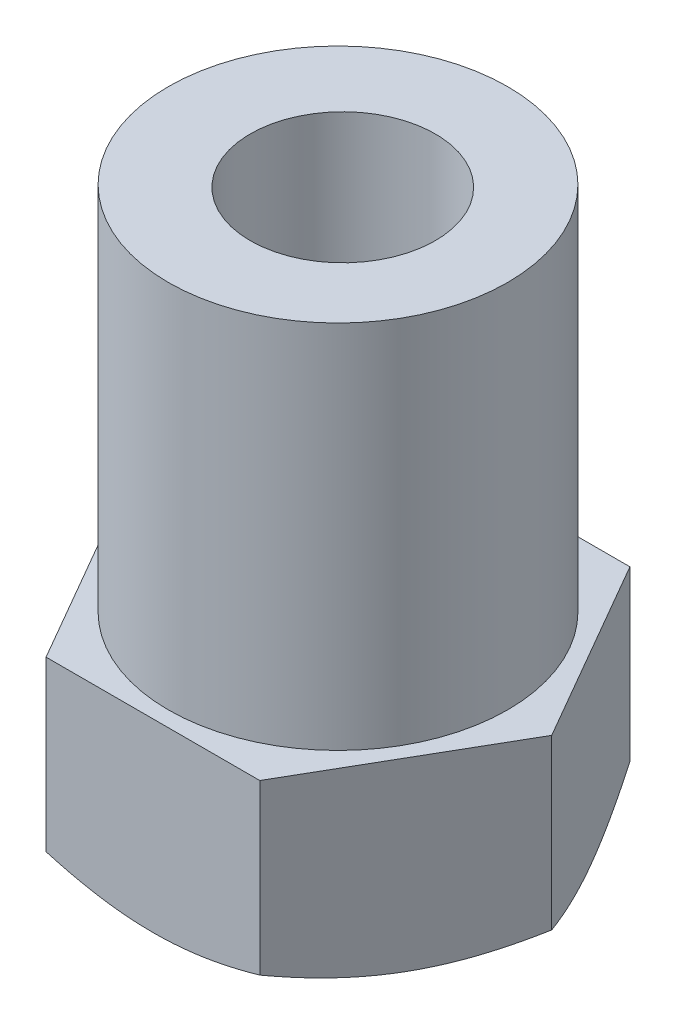
ISO-10303-21;
HEADER;
FILE_DESCRIPTION(('STEP AP214'),'2;1');
FILE_NAME('part.step','',(''),(''),'','','');
FILE_SCHEMA(('AUTOMOTIVE_DESIGN { 1 0 10303 214 1 1 1 1 }'));
ENDSEC;
DATA;
#1=APPLICATION_CONTEXT('core data for automotive mechanical design processes');
#2=APPLICATION_PROTOCOL_DEFINITION('international standard','automotive_design',2000,#1);
#3=PRODUCT_CONTEXT('',#1,'mechanical');
#4=PRODUCT('Part','Part','',(#3));
#5=PRODUCT_RELATED_PRODUCT_CATEGORY('part','',(#4));
#6=PRODUCT_DEFINITION_FORMATION('','',#4);
#7=PRODUCT_DEFINITION_CONTEXT('part definition',#1,'design');
#8=PRODUCT_DEFINITION('design','',#6,#7);
#9=PRODUCT_DEFINITION_SHAPE('','',#8);
#10=(LENGTH_UNIT() NAMED_UNIT(*) SI_UNIT(.MILLI.,.METRE.));
#11=(NAMED_UNIT(*) PLANE_ANGLE_UNIT() SI_UNIT($,.RADIAN.));
#12=(NAMED_UNIT(*) SI_UNIT($,.STERADIAN.) SOLID_ANGLE_UNIT());
#13=UNCERTAINTY_MEASURE_WITH_UNIT(LENGTH_MEASURE(1.E-05),#10,'distance_accuracy_value','');
#14=(GEOMETRIC_REPRESENTATION_CONTEXT(3) GLOBAL_UNCERTAINTY_ASSIGNED_CONTEXT((#13)) GLOBAL_UNIT_ASSIGNED_CONTEXT((#10,
#11,#12)) REPRESENTATION_CONTEXT('',''));
#15=CARTESIAN_POINT('',(0.,0.,0.));
#16=DIRECTION('',(0.,0.,1.));
#17=DIRECTION('',(1.,0.,0.));
#18=AXIS2_PLACEMENT_3D('',#15,#16,#17);
#19=CARTESIAN_POINT('',(3.46410161513781,6.,5.99999999999994));
#20=DIRECTION('',(-0.866025403784441,0.,-0.499999999999995));
#21=DIRECTION('',(-0.499999999999995,0.,0.866025403784442));
#22=AXIS2_PLACEMENT_3D('',#19,#20,#21);
#23=PLANE('',#22);
#24=CARTESIAN_POINT('',(6.92831870032932,0.535965053195548,-0.0002));
#25=CARTESIAN_POINT('',(6.85217369681757,0.492008999115924,0.131687014824876));
#26=CARTESIAN_POINT('',(6.77574478773868,0.450047807220399,0.264065768516575));
#27=CARTESIAN_POINT('',(6.62226628317932,0.37066457679479,0.529898336283081));
#28=CARTESIAN_POINT('',(6.54521643511294,0.333244496395649,0.663352587849512));
#29=CARTESIAN_POINT('',(6.31283321525996,0.228530410086182,1.06585213146133));
#30=CARTESIAN_POINT('',(6.15658254390817,0.168970057381911,1.33648623295938));
#31=CARTESIAN_POINT('',(5.92275625451823,0.0991282107152373,1.74148524632806));
#32=CARTESIAN_POINT('',(5.84587929350303,0.0792322280518352,1.87464004873788));
#33=CARTESIAN_POINT('',(5.69177799808121,0.0458694147989734,2.14155132192066));
#34=CARTESIAN_POINT('',(5.61455369497579,0.0324020161588813,2.27530773847834));
#35=CARTESIAN_POINT('',(5.45997096038122,0.012239591750372,2.54305288876907));
#36=CARTESIAN_POINT('',(5.38261278137646,0.00553687999986948,2.67704118518633));
#37=CARTESIAN_POINT('',(5.22782922676437,-0.00095963658986259,2.94513416595058));
#38=CARTESIAN_POINT('',(5.1504038533067,-0.00075365485191292,3.07923884657427));
#39=CARTESIAN_POINT('',(4.93828180440546,0.00930718522572434,3.44664501267683));
#40=CARTESIAN_POINT('',(4.80365456051592,0.0261978930022923,3.67982623917649));
#41=CARTESIAN_POINT('',(4.53529425885136,0.0797592227905842,4.14463991639402));
#42=CARTESIAN_POINT('',(4.40156214490548,0.116448152963772,4.37627073235188));
#43=CARTESIAN_POINT('',(4.13266173796316,0.208160126695712,4.84201989935194));
#44=CARTESIAN_POINT('',(3.99752737632069,0.263571756710666,5.07607947956508));
#45=CARTESIAN_POINT('',(3.72927392501655,0.389333913183387,5.54070808652956));
#46=CARTESIAN_POINT('',(3.59615139973122,0.459654897316174,5.77128306395563));
#47=CARTESIAN_POINT('',(3.46398614508397,0.535965053195549,6.00019999999994));
#48=B_SPLINE_CURVE_WITH_KNOTS('',3,(#24,#25,#26,#27,#28,#29,#30,#31,#32,#33,#34,#35,#36,#37,#38,
#39,#40,#41,#42,#43,#44,#45,#46,#47),.UNSPECIFIED.,.F.,.F.,(4,2,2,2,2,2,2,2,2,2,2,4),(0.,
0.475482194578524,0.951168694392474,1.90451835622161,2.36951738073401,2.83447530880775,
3.29890435872166,3.76331906154277,4.57182194271091,5.38107376137302,6.20827406017196,
7.03385036012974),.UNSPECIFIED.);
#49=CARTESIAN_POINT('',(6.92820323027548,0.535898384862243,0.));
#50=VERTEX_POINT('',#49);
#51=CARTESIAN_POINT('',(5.19615242270663,0.,2.99999999999996));
#52=VERTEX_POINT('',#51);
#53=EDGE_CURVE('E54',#50,#52,#48,.T.);
#54=ORIENTED_EDGE('',*,*,#53,.F.);
#55=DIRECTION('',(0.,-1.,0.));
#56=VECTOR('',#55,1.);
#57=CARTESIAN_POINT('',(6.92820323027549,6.,0.));
#58=LINE('',#57,#56);
#59=CARTESIAN_POINT('',(6.92820323027549,6.,0.));
#60=VERTEX_POINT('',#59);
#61=EDGE_CURVE('E158',#60,#50,#58,.T.);
#62=ORIENTED_EDGE('',*,*,#61,.F.);
#63=DIRECTION('',(0.499999999999995,0.,-0.866025403784442));
#64=VECTOR('',#63,1.);
#65=CARTESIAN_POINT('',(3.46410161513781,6.,5.99999999999994));
#66=LINE('',#65,#64);
#67=CARTESIAN_POINT('',(3.46410161513781,6.,5.99999999999994));
#68=VERTEX_POINT('',#67);
#69=EDGE_CURVE('E267',#68,#60,#66,.T.);
#70=ORIENTED_EDGE('',*,*,#69,.F.);
#71=DIRECTION('',(0.,-1.,0.));
#72=VECTOR('',#71,1.);
#73=CARTESIAN_POINT('',(3.46410161513781,6.,5.99999999999994));
#74=LINE('',#73,#72);
#75=CARTESIAN_POINT('',(3.46410161513781,0.535898384862243,5.99999999999994));
#76=VERTEX_POINT('',#75);
#77=EDGE_CURVE('E141',#68,#76,#74,.T.);
#78=ORIENTED_EDGE('',*,*,#77,.T.);
#79=EDGE_CURVE('E134',#52,#76,#48,.T.);
#80=ORIENTED_EDGE('',*,*,#79,.F.);
#81=EDGE_LOOP('',(#54,#62,#70,#78,#80));
#82=FACE_BOUND('',#81,.T.);
#83=ADVANCED_FACE('F37',(#82),#23,.F.);
#84=CARTESIAN_POINT('',(6.92820323027549,6.,0.));
#85=DIRECTION('',(-0.866025403784438,0.,0.500000000000001));
#86=DIRECTION('',(0.500000000000001,0.,0.866025403784438));
#87=AXIS2_PLACEMENT_3D('',#84,#85,#86);
#88=PLANE('',#87);
#89=CARTESIAN_POINT('',(3.46398614508389,0.535965053195549,-6.00019999999999));
#90=CARTESIAN_POINT('',(3.54013114859565,0.492008999115924,-5.86831298517511));
#91=CARTESIAN_POINT('',(3.61656005767454,0.450047807220399,-5.73593423148341));
#92=CARTESIAN_POINT('',(3.7700385622339,0.370664576794788,-5.47010166371691));
#93=CARTESIAN_POINT('',(3.84708841030028,0.333244496395646,-5.33664741215048));
#94=CARTESIAN_POINT('',(4.07947163015326,0.228530410086178,-4.93414786853866));
#95=CARTESIAN_POINT('',(4.23572230150505,0.168970057381906,-4.66351376704062));
#96=CARTESIAN_POINT('',(4.469548590895,0.0991282107152301,-4.25851475367193));
#97=CARTESIAN_POINT('',(4.5464255519102,0.0792322280518271,-4.12535995126212));
#98=CARTESIAN_POINT('',(4.70052684733202,0.0458694147989635,-3.85844867807933));
#99=CARTESIAN_POINT('',(4.77775115043744,0.0324020161588704,-3.72469226152165));
#100=CARTESIAN_POINT('',(4.93233388503201,0.0122395917503598,-3.45694711123092));
#101=CARTESIAN_POINT('',(5.00969206403677,0.00553687999985684,-3.32295881481367));
#102=CARTESIAN_POINT('',(5.16447561864886,-0.00095963658987622,-3.05486583404942));
#103=CARTESIAN_POINT('',(5.24190099210653,-0.000753654851927099,-2.92076115342573));
#104=CARTESIAN_POINT('',(5.45402304100778,0.0093071852257087,-2.55335498732317));
#105=CARTESIAN_POINT('',(5.58865028489733,0.0261978930022763,-2.3201737608235));
#106=CARTESIAN_POINT('',(5.8570105865619,0.0797592227905686,-1.85536008360596));
#107=CARTESIAN_POINT('',(5.99074270050778,0.116448152963757,-1.6237292676481));
#108=CARTESIAN_POINT('',(6.25964310745012,0.2081601266957,-1.15798010064802));
#109=CARTESIAN_POINT('',(6.39477746909259,0.263571756710656,-0.923920520434878));
#110=CARTESIAN_POINT('',(6.66303092039674,0.389333913183381,-0.45929191347039));
#111=CARTESIAN_POINT('',(6.79615344568208,0.459654897316172,-0.228716936044309));
#112=CARTESIAN_POINT('',(6.92831870032932,0.535965053195549,0.000200000000000237));
#113=B_SPLINE_CURVE_WITH_KNOTS('',3,(#89,#90,#91,#92,#93,#94,#95,#96,#97,#98,#99,#100,#101,#102,
#103,#104,#105,#106,#107,#108,#109,#110,#111,#112),.UNSPECIFIED.,.F.,.F.,(4,2,2,2,2,2,2,2,2,2,2,
4),(0.,0.475482194578524,0.951168694392473,1.90451835622161,2.36951738073401,2.83447530880775,
3.29890435872166,3.76331906154277,4.57182194271093,5.38107376137306,6.20827406017203,
7.03385036012983),.UNSPECIFIED.);
#114=CARTESIAN_POINT('',(3.46410161513773,0.535898384862243,-5.99999999999999));
#115=VERTEX_POINT('',#114);
#116=CARTESIAN_POINT('',(5.19615242270661,0.,-2.99999999999999));
#117=VERTEX_POINT('',#116);
#118=EDGE_CURVE('E61',#115,#117,#113,.T.);
#119=ORIENTED_EDGE('',*,*,#118,.F.);
#120=DIRECTION('',(0.,-1.,0.));
#121=VECTOR('',#120,1.);
#122=CARTESIAN_POINT('',(3.46410161513773,6.,-5.99999999999999));
#123=LINE('',#122,#121);
#124=CARTESIAN_POINT('',(3.46410161513773,6.,-5.99999999999999));
#125=VERTEX_POINT('',#124);
#126=EDGE_CURVE('E155',#125,#115,#123,.T.);
#127=ORIENTED_EDGE('',*,*,#126,.F.);
#128=DIRECTION('',(-0.500000000000001,0.,-0.866025403784438));
#129=VECTOR('',#128,1.);
#130=CARTESIAN_POINT('',(6.92820323027549,6.,0.));
#131=LINE('',#130,#129);
#132=EDGE_CURVE('E264',#60,#125,#131,.T.);
#133=ORIENTED_EDGE('',*,*,#132,.F.);
#134=ORIENTED_EDGE('',*,*,#61,.T.);
#135=EDGE_CURVE('E184',#117,#50,#113,.T.);
#136=ORIENTED_EDGE('',*,*,#135,.F.);
#137=EDGE_LOOP('',(#119,#127,#133,#134,#136));
#138=FACE_BOUND('',#137,.T.);
#139=ADVANCED_FACE('F191',(#138),#88,.F.);
#140=CARTESIAN_POINT('',(3.46410161513773,6.,-5.99999999999999));
#141=DIRECTION('',(0.,0.,1.));
#142=DIRECTION('',(1.,0.,0.));
#143=AXIS2_PLACEMENT_3D('',#140,#141,#142);
#144=PLANE('',#143);
#145=CARTESIAN_POINT('',(-9.32170610009383,2.93626828606133,-5.99999999999994));
#146=CARTESIAN_POINT('',(-9.05942748994778,2.80897257948739,-5.99999999999994));
#147=CARTESIAN_POINT('',(-8.79654842227734,2.68289293067755,-5.99999999999994));
#148=CARTESIAN_POINT('',(-8.26926996519523,2.43384962701327,-5.99999999999994));
#149=CARTESIAN_POINT('',(-8.00487034529885,2.31088646069025,-5.99999999999995));
#150=CARTESIAN_POINT('',(-7.47287805893235,2.06814539161089,-5.99999999999995));
#151=CARTESIAN_POINT('',(-7.20527585691493,1.94838831513813,-5.99999999999995));
#152=CARTESIAN_POINT('',(-6.66794792061748,1.71375528524554,-5.99999999999995));
#153=CARTESIAN_POINT('',(-6.3982222870888,1.59887910187473,-5.99999999999995));
#154=CARTESIAN_POINT('',(-5.84761185758303,1.37174615381934,-5.99999999999995));
#155=CARTESIAN_POINT('',(-5.56664458706583,1.25968823935341,-5.99999999999995));
#156=CARTESIAN_POINT('',(-5.00142934365166,1.04401311176654,-5.99999999999996));
#157=CARTESIAN_POINT('',(-4.71718100784113,0.940396842777186,-5.99999999999996));
#158=CARTESIAN_POINT('',(-4.14547832456104,0.744311363526736,-5.99999999999996));
#159=CARTESIAN_POINT('',(-3.85803172842164,0.651819775387287,-5.99999999999996));
#160=CARTESIAN_POINT('',(-3.27901320341143,0.480940756443021,-5.99999999999996));
#161=CARTESIAN_POINT('',(-2.98744259860318,0.402548904854908,-5.99999999999996));
#162=CARTESIAN_POINT('',(-2.40156260413436,0.264013046163309,-5.99999999999997));
#163=CARTESIAN_POINT('',(-2.10727593689591,0.203774477790456,-5.99999999999997));
#164=CARTESIAN_POINT('',(-1.51498559739138,0.104982485532357,-5.99999999999997));
#165=CARTESIAN_POINT('',(-1.21698231020321,0.0664268338551744,-5.99999999999997));
#166=CARTESIAN_POINT('',(-0.770357280469096,0.0274145926471733,-5.99999999999997));
#167=CARTESIAN_POINT('',(-0.62252035969347,0.0175519575519398,-5.99999999999997));
#168=CARTESIAN_POINT('',(-0.326555350237392,0.00408281273162104,-5.99999999999997));
#169=CARTESIAN_POINT('',(-0.178427266463828,0.000476198465328818,-5.99999999999997));
#170=CARTESIAN_POINT('',(0.117849409734018,-0.000387920331431642,-5.99999999999997));
#171=CARTESIAN_POINT('',(0.265998002485718,0.00235469205068252,-5.99999999999998));
#172=CARTESIAN_POINT('',(0.562047898198595,0.0141201362698796,-5.99999999999998));
#173=CARTESIAN_POINT('',(0.709949188567988,0.0231432786819305,-5.99999999999998));
#174=CARTESIAN_POINT('',(1.06476235614729,0.0521325507745445,-5.99999999999998));
#175=CARTESIAN_POINT('',(1.27143873101579,0.0750430371848986,-5.99999999999998));
#176=CARTESIAN_POINT('',(1.68325996725064,0.131883826739422,-5.99999999999998));
#177=CARTESIAN_POINT('',(1.88840461995168,0.165815604263573,-5.99999999999998));
#178=CARTESIAN_POINT('',(2.50129297541129,0.282343477139922,-5.99999999999998));
#179=CARTESIAN_POINT('',(2.9062764624444,0.379652257651257,-5.99999999999998));
#180=CARTESIAN_POINT('',(3.51212276785679,0.548491333286524,-5.99999999999999));
#181=CARTESIAN_POINT('',(3.71612115245218,0.609416830591716,-5.99999999999999));
#182=CARTESIAN_POINT('',(4.12213526948022,0.737609316322647,-5.99999999999999));
#183=CARTESIAN_POINT('',(4.32415098659786,0.804876353690758,-5.99999999999999));
#184=CARTESIAN_POINT('',(4.72626733374106,0.944671118803804,-5.99999999999999));
#185=CARTESIAN_POINT('',(4.92636853438925,1.01719722005306,-5.99999999999999));
#186=CARTESIAN_POINT('',(5.32490794748636,1.16665510814652,-5.99999999999999));
#187=CARTESIAN_POINT('',(5.52334620019195,1.2435867879852,-5.99999999999999));
#188=CARTESIAN_POINT('',(6.07043167806018,1.46154554566711,-6.));
#189=CARTESIAN_POINT('',(6.41752595327204,1.60646727382258,-6.));
#190=CARTESIAN_POINT('',(7.10809702175237,1.90471767855231,-6.));
#191=CARTESIAN_POINT('',(7.45157339121169,2.05804732727469,-6.));
#192=CARTESIAN_POINT('',(8.13577411795127,2.37105843101034,-6.));
#193=CARTESIAN_POINT('',(8.47649733403221,2.53074237222531,-6.));
#194=CARTESIAN_POINT('',(9.15563391226047,2.85489555670699,-6.00000000000001));
#195=CARTESIAN_POINT('',(9.49404737312788,3.01936459385498,-6.00000000000001));
#196=CARTESIAN_POINT('',(10.1695864506745,3.35228800406054,-6.00000000000001));
#197=CARTESIAN_POINT('',(10.5067090899477,3.52074840602353,-6.00000000000001));
#198=CARTESIAN_POINT('',(11.1794714245792,3.86060723541196,-6.00000000000002));
#199=CARTESIAN_POINT('',(11.515111106743,4.03200568891218,-6.00000000000002));
#200=CARTESIAN_POINT('',(12.1851032467809,4.37711114648597,-6.00000000000002));
#201=CARTESIAN_POINT('',(12.5194559808097,4.55081761505693,-6.00000000000002));
#202=CARTESIAN_POINT('',(13.1871650034419,4.90013625984474,-6.00000000000002));
#203=CARTESIAN_POINT('',(13.5205212883227,5.07574844316982,-6.00000000000002));
#204=CARTESIAN_POINT('',(14.4465420926974,5.56634272989304,-6.00000000000003));
#205=CARTESIAN_POINT('',(15.0383112548726,5.8830144700867,-6.00000000000003));
#206=CARTESIAN_POINT('',(16.2199680070127,6.51993179501591,-6.00000000000003));
#207=CARTESIAN_POINT('',(16.8098554739098,6.84017760758344,-6.00000000000004));
#208=CARTESIAN_POINT('',(17.9862318302025,7.48224811262945,-6.00000000000004));
#209=CARTESIAN_POINT('',(18.5727255030958,7.80406404912021,-6.00000000000004));
#210=CARTESIAN_POINT('',(19.7445401362543,8.44971455942649,-6.00000000000005));
#211=CARTESIAN_POINT('',(20.3298611863147,8.77354897020581,-6.00000000000005));
#212=CARTESIAN_POINT('',(20.9147740511284,9.09811386900028,-6.00000000000005));
#213=B_SPLINE_CURVE_WITH_KNOTS('',3,(#145,#146,#147,#148,#149,#150,#151,#152,#153,#154,#155,
#156,#157,#158,#159,#160,#161,#162,#163,#164,#165,#166,#167,#168,#169,#170,#171,#172,#173,#174,
#175,#176,#177,#178,#179,#180,#181,#182,#183,#184,#185,#186,#187,#188,#189,#190,#191,#192,#193,
#194,#195,#196,#197,#198,#199,#200,#201,#202,#203,#204,#205,#206,#207,#208,#209,#210,#211,#212),
.UNSPECIFIED.,.F.,.F.,(4,2,2,2,2,2,2,2,2,2,2,2,2,2,2,2,2,2,2,2,2,2,2,2,2,2,2,2,2,2,2,2,2,4),(0.,
0.874623907752453,1.7493840816804,2.62887576075158,3.50832595874105,4.41568816973215,
5.32315172312656,6.22875820445498,7.13408024816029,8.03460150054087,8.93503021275708,
9.37941457322982,9.82379150774823,10.2681766249432,10.7125837187388,11.336059317126,
11.9596183557195,13.2073801203786,13.8460322887999,14.4846893865777,15.1231497994313,
15.7615947115212,16.8898270119452,18.0181900380451,19.1469989778808,20.275759365883,
21.4063497496207,22.536950172379,23.6672927030751,24.7976394513411,26.8111360840954,
28.8247618102973,30.8317108729039,32.8384998783162),.UNSPECIFIED.);
#214=CARTESIAN_POINT('',(-3.46410161513777,0.535898384862243,-5.99999999999996));
#215=VERTEX_POINT('',#214);
#216=CARTESIAN_POINT('',(0.,0.,-5.99999999999998));
#217=VERTEX_POINT('',#216);
#218=EDGE_CURVE('E282',#215,#217,#213,.T.);
#219=ORIENTED_EDGE('',*,*,#218,.F.);
#220=DIRECTION('',(0.,-1.,0.));
#221=VECTOR('',#220,1.);
#222=CARTESIAN_POINT('',(-3.46410161513777,6.,-5.99999999999996));
#223=LINE('',#222,#221);
#224=CARTESIAN_POINT('',(-3.46410161513777,6.,-5.99999999999996));
#225=VERTEX_POINT('',#224);
#226=EDGE_CURVE('E145',#225,#215,#223,.T.);
#227=ORIENTED_EDGE('',*,*,#226,.F.);
#228=DIRECTION('',(-1.,0.,0.));
#229=VECTOR('',#228,1.);
#230=CARTESIAN_POINT('',(3.46410161513773,6.,-5.99999999999999));
#231=LINE('',#230,#229);
#232=EDGE_CURVE('E260',#125,#225,#231,.T.);
#233=ORIENTED_EDGE('',*,*,#232,.F.);
#234=ORIENTED_EDGE('',*,*,#126,.T.);
#235=EDGE_CURVE('E211',#217,#115,#213,.T.);
#236=ORIENTED_EDGE('',*,*,#235,.F.);
#237=EDGE_LOOP('',(#219,#227,#233,#234,#236));
#238=FACE_BOUND('',#237,.T.);
#239=ADVANCED_FACE('F315',(#238),#144,.F.);
#240=CARTESIAN_POINT('',(-3.46410161513777,6.,-5.99999999999996));
#241=DIRECTION('',(0.866025403784441,0.,0.499999999999995));
#242=DIRECTION('',(0.499999999999995,0.,-0.866025403784441));
#243=AXIS2_PLACEMENT_3D('',#240,#241,#242);
#244=PLANE('',#243);
#245=CARTESIAN_POINT('',(-6.92831870032932,0.535965053195549,0.000200000000048379));
#246=CARTESIAN_POINT('',(-6.85217369681757,0.492008999115925,-0.131687014824827));
#247=CARTESIAN_POINT('',(-6.77574478773868,0.450047807220399,-0.264065768516526));
#248=CARTESIAN_POINT('',(-6.62226628317932,0.370664576794789,-0.529898336283031));
#249=CARTESIAN_POINT('',(-6.54521643511294,0.333244496395646,-0.663352587849462));
#250=CARTESIAN_POINT('',(-6.31283321525996,0.228530410086178,-1.06585213146128));
#251=CARTESIAN_POINT('',(-6.15658254390817,0.168970057381906,-1.33648623295933));
#252=CARTESIAN_POINT('',(-5.92275625451823,0.0991282107152303,-1.74148524632801));
#253=CARTESIAN_POINT('',(-5.84587929350303,0.0792322280518271,-1.87464004873783));
#254=CARTESIAN_POINT('',(-5.69177799808121,0.0458694147989635,-2.14155132192061));
#255=CARTESIAN_POINT('',(-5.61455369497579,0.0324020161588706,-2.27530773847829));
#256=CARTESIAN_POINT('',(-5.45997096038123,0.0122395917503599,-2.54305288876902));
#257=CARTESIAN_POINT('',(-5.38261278137646,0.0055368799998565,-2.67704118518628));
#258=CARTESIAN_POINT('',(-5.22782922676438,-0.00095963658987664,-2.94513416595053));
#259=CARTESIAN_POINT('',(-5.1504038533067,-0.000753654851927225,-3.07923884657422));
#260=CARTESIAN_POINT('',(-4.93828180440546,0.00930718522570892,-3.44664501267678));
#261=CARTESIAN_POINT('',(-4.80365456051591,0.0261978930022761,-3.67982623917645));
#262=CARTESIAN_POINT('',(-4.53529425885135,0.0797592227905683,-4.144639916394));
#263=CARTESIAN_POINT('',(-4.40156214490547,0.116448152963757,-4.37627073235186));
#264=CARTESIAN_POINT('',(-4.13266173796313,0.2081601266957,-4.84201989935193));
#265=CARTESIAN_POINT('',(-3.99752737632066,0.263571756710656,-5.07607947956508));
#266=CARTESIAN_POINT('',(-3.72927392501652,0.389333913183381,-5.54070808652957));
#267=CARTESIAN_POINT('',(-3.59615139973118,0.45965489731617,-5.77128306395565));
#268=CARTESIAN_POINT('',(-3.46398614508393,0.535965053195547,-6.00019999999996));
#269=B_SPLINE_CURVE_WITH_KNOTS('',3,(#245,#246,#247,#248,#249,#250,#251,#252,#253,#254,#255,
#256,#257,#258,#259,#260,#261,#262,#263,#264,#265,#266,#267,#268),.UNSPECIFIED.,.F.,.F.,(4,2,2,
2,2,2,2,2,2,2,2,4),(0.,0.475482194578523,0.951168694392473,1.90451835622161,2.36951738073401,
2.83447530880775,3.29890435872166,3.76331906154277,4.57182194271093,5.38107376137306,
6.20827406017203,7.03385036012982),.UNSPECIFIED.);
#270=CARTESIAN_POINT('',(-6.92820323027549,0.535898384862243,0.));
#271=VERTEX_POINT('',#270);
#272=CARTESIAN_POINT('',(-5.19615242270663,0.,-2.99999999999996));
#273=VERTEX_POINT('',#272);
#274=EDGE_CURVE('E194',#271,#273,#269,.T.);
#275=ORIENTED_EDGE('',*,*,#274,.F.);
#276=DIRECTION('',(0.,-1.,0.));
#277=VECTOR('',#276,1.);
#278=CARTESIAN_POINT('',(-6.92820323027549,6.,0.));
#279=LINE('',#278,#277);
#280=CARTESIAN_POINT('',(-6.92820323027549,6.,0.));
#281=VERTEX_POINT('',#280);
#282=EDGE_CURVE('E140',#281,#271,#279,.T.);
#283=ORIENTED_EDGE('',*,*,#282,.F.);
#284=DIRECTION('',(-0.499999999999995,0.,0.866025403784441));
#285=VECTOR('',#284,1.);
#286=CARTESIAN_POINT('',(-3.46410161513777,6.,-5.99999999999996));
#287=LINE('',#286,#285);
#288=EDGE_CURVE('E257',#225,#281,#287,.T.);
#289=ORIENTED_EDGE('',*,*,#288,.F.);
#290=ORIENTED_EDGE('',*,*,#226,.T.);
#291=EDGE_CURVE('E196',#273,#215,#269,.T.);
#292=ORIENTED_EDGE('',*,*,#291,.F.);
#293=EDGE_LOOP('',(#275,#283,#289,#290,#292));
#294=FACE_BOUND('',#293,.T.);
#295=ADVANCED_FACE('F252',(#294),#244,.F.);
#296=CARTESIAN_POINT('',(-6.92820323027549,6.,0.));
#297=DIRECTION('',(0.866025403784434,0.,-0.500000000000007));
#298=DIRECTION('',(-0.500000000000007,0.,-0.866025403784435));
#299=AXIS2_PLACEMENT_3D('',#296,#297,#298);
#300=PLANE('',#299);
#301=CARTESIAN_POINT('',(-3.46398614508385,0.535965053195549,6.00020000000001));
#302=CARTESIAN_POINT('',(-3.54013114859561,0.492008999115925,5.86831298517514));
#303=CARTESIAN_POINT('',(-3.6165600576745,0.450047807220399,5.73593423148344));
#304=CARTESIAN_POINT('',(-3.77003856223386,0.370664576794788,5.47010166371694));
#305=CARTESIAN_POINT('',(-3.84708841030024,0.333244496395646,5.33664741215051));
#306=CARTESIAN_POINT('',(-4.07947163015323,0.228530410086178,4.93414786853869));
#307=CARTESIAN_POINT('',(-4.23572230150502,0.168970057381905,4.66351376704065));
#308=CARTESIAN_POINT('',(-4.46954859089497,0.0991282107152297,4.25851475367196));
#309=CARTESIAN_POINT('',(-4.54642555191017,0.0792322280518269,4.12535995126215));
#310=CARTESIAN_POINT('',(-4.700526847332,0.0458694147989638,3.85844867807937));
#311=CARTESIAN_POINT('',(-4.77775115043741,0.032402016158871,3.72469226152169));
#312=CARTESIAN_POINT('',(-4.93233388503198,0.0122395917503602,3.45694711123096));
#313=CARTESIAN_POINT('',(-5.00969206403675,0.00553687999985679,3.3229588148137));
#314=CARTESIAN_POINT('',(-5.16447561864884,-0.000959636589876431,3.05486583404945));
#315=CARTESIAN_POINT('',(-5.24190099210651,-0.000753654851927012,2.92076115342577));
#316=CARTESIAN_POINT('',(-5.45402304100776,0.00930718522570924,2.55335498732321));
#317=CARTESIAN_POINT('',(-5.58865028489731,0.0261978930022767,2.32017376082354));
#318=CARTESIAN_POINT('',(-5.85701058656188,0.0797592227905688,1.855360083606));
#319=CARTESIAN_POINT('',(-5.99074270050777,0.116448152963757,1.62372926764814));
#320=CARTESIAN_POINT('',(-6.25964310745011,0.2081601266957,1.15798010064807));
#321=CARTESIAN_POINT('',(-6.39477746909258,0.263571756710657,0.923920520434922));
#322=CARTESIAN_POINT('',(-6.66303092039673,0.389333913183382,0.459291913470437));
#323=CARTESIAN_POINT('',(-6.79615344568207,0.459654897316172,0.228716936044357));
#324=CARTESIAN_POINT('',(-6.92831870032932,0.535965053195549,-0.000199999999951766));
#325=B_SPLINE_CURVE_WITH_KNOTS('',3,(#301,#302,#303,#304,#305,#306,#307,#308,#309,#310,#311,
#312,#313,#314,#315,#316,#317,#318,#319,#320,#321,#322,#323,#324),.UNSPECIFIED.,.F.,.F.,(4,2,2,
2,2,2,2,2,2,2,2,4),(0.,0.475482194578524,0.951168694392474,1.90451835622161,2.36951738073401,
2.83447530880775,3.29890435872166,3.76331906154277,4.57182194271093,5.38107376137306,
6.20827406017203,7.03385036012983),.UNSPECIFIED.);
#326=CARTESIAN_POINT('',(-3.46410161513769,0.535898384862243,6.00000000000001));
#327=VERTEX_POINT('',#326);
#328=CARTESIAN_POINT('',(-5.19615242270659,0.,3.00000000000003));
#329=VERTEX_POINT('',#328);
#330=EDGE_CURVE('E114',#327,#329,#325,.T.);
#331=ORIENTED_EDGE('',*,*,#330,.F.);
#332=DIRECTION('',(0.,-1.,0.));
#333=VECTOR('',#332,1.);
#334=CARTESIAN_POINT('',(-3.46410161513769,6.,6.00000000000001));
#335=LINE('',#334,#333);
#336=CARTESIAN_POINT('',(-3.46410161513769,6.,6.00000000000001));
#337=VERTEX_POINT('',#336);
#338=EDGE_CURVE('E129',#337,#327,#335,.T.);
#339=ORIENTED_EDGE('',*,*,#338,.F.);
#340=DIRECTION('',(0.500000000000007,0.,0.866025403784435));
#341=VECTOR('',#340,1.);
#342=CARTESIAN_POINT('',(-6.92820323027549,6.,0.));
#343=LINE('',#342,#341);
#344=EDGE_CURVE('E254',#281,#337,#343,.T.);
#345=ORIENTED_EDGE('',*,*,#344,.F.);
#346=ORIENTED_EDGE('',*,*,#282,.T.);
#347=EDGE_CURVE('E132',#329,#271,#325,.T.);
#348=ORIENTED_EDGE('',*,*,#347,.F.);
#349=EDGE_LOOP('',(#331,#339,#345,#346,#348));
#350=FACE_BOUND('',#349,.T.);
#351=ADVANCED_FACE('F127',(#350),#300,.F.);
#352=CARTESIAN_POINT('',(-3.46410161513769,6.,6.00000000000001));
#353=DIRECTION('',(0.,0.,-1.));
#354=DIRECTION('',(-1.,0.,0.));
#355=AXIS2_PLACEMENT_3D('',#352,#353,#354);
#356=PLANE('',#355);
#357=CARTESIAN_POINT('',(-9.32170610042523,2.93626828622226,6.00000000000007));
#358=CARTESIAN_POINT('',(-9.05942749026803,2.80897257964158,6.00000000000007));
#359=CARTESIAN_POINT('',(-8.79654842258643,2.68289293082501,6.00000000000007));
#360=CARTESIAN_POINT('',(-8.26926996548196,2.43384962714728,6.00000000000006));
#361=CARTESIAN_POINT('',(-8.00487034557438,2.31088646081757,6.00000000000006));
#362=CARTESIAN_POINT('',(-7.47287805918532,2.06814539172479,6.00000000000005));
#363=CARTESIAN_POINT('',(-7.20527585715652,1.94838831524533,6.00000000000005));
#364=CARTESIAN_POINT('',(-6.66794792083625,1.71375528533943,6.00000000000005));
#365=CARTESIAN_POINT('',(-6.39822228729612,1.59887910196203,6.00000000000004));
#366=CARTESIAN_POINT('',(-5.84761185776662,1.3717461538933,6.00000000000004));
#367=CARTESIAN_POINT('',(-5.56664458723714,1.25968823942064,6.00000000000003));
#368=CARTESIAN_POINT('',(-5.0014293437982,1.04401311182066,6.00000000000003));
#369=CARTESIAN_POINT('',(-4.71718100797519,0.940396842824938,6.00000000000002));
#370=CARTESIAN_POINT('',(-4.1454783246699,0.744311363562366,6.00000000000002));
#371=CARTESIAN_POINT('',(-3.85803172851779,0.651819775417163,6.00000000000002));
#372=CARTESIAN_POINT('',(-3.27901320348181,0.480940756462343,6.00000000000001));
#373=CARTESIAN_POINT('',(-2.9874425986605,0.402548904869428,6.00000000000001));
#374=CARTESIAN_POINT('',(-2.40156260415874,0.264013046168153,6.));
#375=CARTESIAN_POINT('',(-2.10727593690032,0.203774477790809,6.));
#376=CARTESIAN_POINT('',(-1.51498559735538,0.104982485526762,5.99999999999999));
#377=CARTESIAN_POINT('',(-1.21698231014676,0.0664268338481196,5.99999999999999));
#378=CARTESIAN_POINT('',(-0.770357280382124,0.0274145926406394,5.99999999999998));
#379=CARTESIAN_POINT('',(-0.622520359596468,0.0175519575460189,5.99999999999998));
#380=CARTESIAN_POINT('',(-0.326555350120353,0.00408281272780617,5.99999999999998));
#381=CARTESIAN_POINT('',(-0.178427266336783,0.00047619846300698,5.99999999999998));
#382=CARTESIAN_POINT('',(0.117849409881001,-0.000387920329908069,5.99999999999997));
#383=CARTESIAN_POINT('',(0.26599800264263,0.00235469205455867,5.99999999999997));
#384=CARTESIAN_POINT('',(0.562047898375234,0.0141201362792548,5.99999999999997));
#385=CARTESIAN_POINT('',(0.709949188754425,0.0231432786944523,5.99999999999997));
#386=CARTESIAN_POINT('',(1.06476235634902,0.0521325507948081,5.99999999999996));
#387=CARTESIAN_POINT('',(1.27143873122296,0.0750430372096301,5.99999999999996));
#388=CARTESIAN_POINT('',(1.68325996746846,0.13188382677333,5.99999999999996));
#389=CARTESIAN_POINT('',(1.88840462017471,0.165815604302191,5.99999999999995));
#390=CARTESIAN_POINT('',(2.50129297564965,0.282343477192769,5.99999999999995));
#391=CARTESIAN_POINT('',(2.9062764626926,0.379652257713721,5.99999999999994));
#392=CARTESIAN_POINT('',(3.5121227681197,0.548491333363193,5.99999999999994));
#393=CARTESIAN_POINT('',(3.71612115272011,0.609416830673156,5.99999999999994));
#394=CARTESIAN_POINT('',(4.12213526975811,0.737609316413489,5.99999999999993));
#395=CARTESIAN_POINT('',(4.32415098688071,0.804876353786231,5.99999999999993));
#396=CARTESIAN_POINT('',(4.7262673340338,0.944671118908377,5.99999999999993));
#397=CARTESIAN_POINT('',(4.92636853468691,1.0171972201621,5.99999999999992));
#398=CARTESIAN_POINT('',(5.32490794779387,1.16665510826435,5.99999999999992));
#399=CARTESIAN_POINT('',(5.52334620050438,1.24358678810736,5.99999999999992));
#400=CARTESIAN_POINT('',(6.07043167837534,1.46154554579669,5.99999999999991));
#401=CARTESIAN_POINT('',(6.41752595358517,1.60646727395475,5.99999999999991));
#402=CARTESIAN_POINT('',(7.10809702206169,1.90471767868889,5.9999999999999));
#403=CARTESIAN_POINT('',(7.45157339151925,2.05804732741306,5.9999999999999));
#404=CARTESIAN_POINT('',(8.13577411825548,2.37105843115176,5.99999999999989));
#405=CARTESIAN_POINT('',(8.47649733433484,2.53074237236797,5.99999999999989));
#406=CARTESIAN_POINT('',(9.15563391256011,2.85489555685172,5.99999999999988));
#407=CARTESIAN_POINT('',(9.49404737342611,3.01936459400055,5.99999999999988));
#408=CARTESIAN_POINT('',(10.1695864509699,3.35228800420747,5.99999999999987));
#409=CARTESIAN_POINT('',(10.5067090902418,3.52074840617097,5.99999999999986));
#410=CARTESIAN_POINT('',(11.1794714248706,3.86060723556021,5.99999999999986));
#411=CARTESIAN_POINT('',(11.5151111070332,4.03200568906072,5.99999999999985));
#412=CARTESIAN_POINT('',(12.1851032470686,4.37711114663497,5.99999999999985));
#413=CARTESIAN_POINT('',(12.5194559810962,4.55081761520607,5.99999999999984));
#414=CARTESIAN_POINT('',(13.1871650037261,4.90013625999407,5.99999999999984));
#415=CARTESIAN_POINT('',(13.5205212886058,5.07574844331918,5.99999999999983));
#416=CARTESIAN_POINT('',(14.4465420929795,5.56634273004345,5.99999999999982));
#417=CARTESIAN_POINT('',(15.0383112551549,5.88301447023804,5.99999999999982));
#418=CARTESIAN_POINT('',(16.2199680072954,6.51993179516897,5.9999999999998));
#419=CARTESIAN_POINT('',(16.8098554741928,6.84017760773726,5.9999999999998));
#420=CARTESIAN_POINT('',(17.9862318304863,7.48224811278486,5.99999999999979));
#421=CARTESIAN_POINT('',(18.5727255033802,7.80406404927644,5.99999999999978));
#422=CARTESIAN_POINT('',(19.74454013654,8.44971455958429,5.99999999999977));
#423=CARTESIAN_POINT('',(20.3298611866011,8.77354897036436,5.99999999999976));
#424=CARTESIAN_POINT('',(20.9147740514155,9.09811386915954,5.99999999999975));
#425=B_SPLINE_CURVE_WITH_KNOTS('',3,(#357,#358,#359,#360,#361,#362,#363,#364,#365,#366,#367,
#368,#369,#370,#371,#372,#373,#374,#375,#376,#377,#378,#379,#380,#381,#382,#383,#384,#385,#386,
#387,#388,#389,#390,#391,#392,#393,#394,#395,#396,#397,#398,#399,#400,#401,#402,#403,#404,#405,
#406,#407,#408,#409,#410,#411,#412,#413,#414,#415,#416,#417,#418,#419,#420,#421,#422,#423,#424),
.UNSPECIFIED.,.F.,.F.,(4,2,2,2,2,2,2,2,2,2,2,2,2,2,2,2,2,2,2,2,2,2,2,2,2,2,2,2,2,2,2,2,2,4),(0.,
0.874623907791384,1.74938408175826,2.62887576086881,3.50832595889764,4.41568816993044,
5.32315172336656,6.22875820473655,7.1340802484834,8.03460150092524,8.93503021320262,
9.37941457370524,9.82379150825353,10.2681766254784,10.7125837193038,11.3360593177088,
11.9596183563199,13.2073801210145,13.8460322894544,14.4846893872506,15.1231498001228,
15.7615947122311,16.8898270126525,18.0181900387497,19.1469989785828,20.2757593665823,
21.406349750317,22.5369501730723,23.6672927037654,24.7976394520285,26.8111360847846,
28.8247618109883,30.8317108735977,32.8384998790128),.UNSPECIFIED.);
#426=CARTESIAN_POINT('',(0.,0.,5.99999999999998));
#427=VERTEX_POINT('',#426);
#428=EDGE_CURVE('E121',#76,#427,#425,.F.);
#429=ORIENTED_EDGE('',*,*,#428,.F.);
#430=ORIENTED_EDGE('',*,*,#77,.F.);
#431=DIRECTION('',(1.,0.,0.));
#432=VECTOR('',#431,1.);
#433=CARTESIAN_POINT('',(-3.46410161513769,6.,6.00000000000001));
#434=LINE('',#433,#432);
#435=EDGE_CURVE('E138',#337,#68,#434,.T.);
#436=ORIENTED_EDGE('',*,*,#435,.F.);
#437=ORIENTED_EDGE('',*,*,#338,.T.);
#438=EDGE_CURVE('E111',#427,#327,#425,.F.);
#439=ORIENTED_EDGE('',*,*,#438,.F.);
#440=EDGE_LOOP('',(#429,#430,#436,#437,#439));
#441=FACE_BOUND('',#440,.T.);
#442=ADVANCED_FACE('F136',(#441),#356,.F.);
#443=CARTESIAN_POINT('',(0.,0.,0.));
#444=DIRECTION('',(0.,1.,0.));
#445=DIRECTION('',(0.,0.,1.));
#446=AXIS2_PLACEMENT_3D('',#443,#444,#445);
#447=PLANE('',#446);
#448=CARTESIAN_POINT('',(0.154901243976949,0.,0.));
#449=DIRECTION('',(0.,1.,0.));
#450=DIRECTION('',(0.,0.,1.));
#451=AXIS2_PLACEMENT_3D('',#448,#449,#450);
#452=CIRCLE('',#451,3.);
#453=CARTESIAN_POINT('',(0.154901243976949,0.,3.));
#454=VERTEX_POINT('',#453);
#455=EDGE_CURVE('E275',#454,#454,#452,.T.);
#456=ORIENTED_EDGE('',*,*,#455,.T.);
#457=EDGE_LOOP('',(#456));
#458=FACE_BOUND('',#457,.T.);
#459=CARTESIAN_POINT('',(0.,0.,0.));
#460=DIRECTION('',(0.,1.,0.));
#461=DIRECTION('',(0.,0.,1.));
#462=AXIS2_PLACEMENT_3D('',#459,#460,#461);
#463=CIRCLE('',#462,5.99999999999997);
#464=EDGE_CURVE('E12',#427,#52,#463,.T.);
#465=ORIENTED_EDGE('',*,*,#464,.F.);
#466=EDGE_CURVE('E41',#329,#427,#463,.T.);
#467=ORIENTED_EDGE('',*,*,#466,.F.);
#468=EDGE_CURVE('E166',#273,#329,#463,.T.);
#469=ORIENTED_EDGE('',*,*,#468,.F.);
#470=EDGE_CURVE('E168',#217,#273,#463,.T.);
#471=ORIENTED_EDGE('',*,*,#470,.F.);
#472=CARTESIAN_POINT('',(0.,0.,0.));
#473=DIRECTION('',(0.,-1.,0.));
#474=DIRECTION('',(0.,0.,-1.));
#475=AXIS2_PLACEMENT_3D('',#472,#473,#474);
#476=CIRCLE('',#475,5.99999999999998);
#477=EDGE_CURVE('E122',#217,#117,#476,.T.);
#478=ORIENTED_EDGE('',*,*,#477,.T.);
#479=EDGE_CURVE('E47',#52,#117,#463,.T.);
#480=ORIENTED_EDGE('',*,*,#479,.F.);
#481=EDGE_LOOP('',(#465,#467,#469,#471,#478,#480));
#482=FACE_BOUND('',#481,.T.);
#483=ADVANCED_FACE('F187',(#458,#482),#447,.F.);
#484=CARTESIAN_POINT('',(0.,6.,0.));
#485=DIRECTION('',(0.,1.,0.));
#486=DIRECTION('',(0.,0.,1.));
#487=AXIS2_PLACEMENT_3D('',#484,#485,#486);
#488=PLANE('',#487);
#489=ORIENTED_EDGE('',*,*,#69,.T.);
#490=ORIENTED_EDGE('',*,*,#132,.T.);
#491=ORIENTED_EDGE('',*,*,#232,.T.);
#492=ORIENTED_EDGE('',*,*,#288,.T.);
#493=ORIENTED_EDGE('',*,*,#344,.T.);
#494=ORIENTED_EDGE('',*,*,#435,.T.);
#495=EDGE_LOOP('',(#489,#490,#491,#492,#493,#494));
#496=FACE_BOUND('',#495,.T.);
#497=CARTESIAN_POINT('',(0.,6.,0.));
#498=DIRECTION('',(0.,1.,0.));
#499=DIRECTION('',(0.,0.,1.));
#500=AXIS2_PLACEMENT_3D('',#497,#498,#499);
#501=CIRCLE('',#500,5.5);
#502=CARTESIAN_POINT('',(0.,6.,5.5));
#503=VERTEX_POINT('',#502);
#504=EDGE_CURVE('E272',#503,#503,#501,.T.);
#505=ORIENTED_EDGE('',*,*,#504,.F.);
#506=EDGE_LOOP('',(#505));
#507=FACE_BOUND('',#506,.T.);
#508=ADVANCED_FACE('F300',(#496,#507),#488,.T.);
#509=CARTESIAN_POINT('',(0.,18.,0.));
#510=DIRECTION('',(0.,-1.,0.));
#511=DIRECTION('',(0.,0.,-1.));
#512=AXIS2_PLACEMENT_3D('',#509,#510,#511);
#513=CYLINDRICAL_SURFACE('',#512,5.5);
#514=CARTESIAN_POINT('',(0.,18.,0.));
#515=DIRECTION('',(0.,1.,0.));
#516=DIRECTION('',(0.,0.,1.));
#517=AXIS2_PLACEMENT_3D('',#514,#515,#516);
#518=CIRCLE('',#517,5.5);
#519=CARTESIAN_POINT('',(0.,18.,5.5));
#520=VERTEX_POINT('',#519);
#521=EDGE_CURVE('E271',#520,#520,#518,.T.);
#522=ORIENTED_EDGE('',*,*,#521,.F.);
#523=EDGE_LOOP('',(#522));
#524=FACE_BOUND('',#523,.T.);
#525=ORIENTED_EDGE('',*,*,#504,.T.);
#526=EDGE_LOOP('',(#525));
#527=FACE_BOUND('',#526,.T.);
#528=ADVANCED_FACE('F295',(#524,#527),#513,.T.);
#529=CARTESIAN_POINT('',(0.,18.,0.));
#530=DIRECTION('',(0.,1.,0.));
#531=DIRECTION('',(0.,0.,1.));
#532=AXIS2_PLACEMENT_3D('',#529,#530,#531);
#533=PLANE('',#532);
#534=CARTESIAN_POINT('',(0.154901243976949,18.,0.));
#535=DIRECTION('',(0.,1.,0.));
#536=DIRECTION('',(0.,0.,1.));
#537=AXIS2_PLACEMENT_3D('',#534,#535,#536);
#538=CIRCLE('',#537,3.);
#539=CARTESIAN_POINT('',(0.154901243976949,18.,3.));
#540=VERTEX_POINT('',#539);
#541=EDGE_CURVE('E279',#540,#540,#538,.T.);
#542=ORIENTED_EDGE('',*,*,#541,.F.);
#543=EDGE_LOOP('',(#542));
#544=FACE_BOUND('',#543,.T.);
#545=ORIENTED_EDGE('',*,*,#521,.T.);
#546=EDGE_LOOP('',(#545));
#547=FACE_BOUND('',#546,.T.);
#548=ADVANCED_FACE('F290',(#544,#547),#533,.T.);
#549=CARTESIAN_POINT('',(0.154901243976949,0.,0.));
#550=DIRECTION('',(0.,1.,0.));
#551=DIRECTION('',(0.,0.,1.));
#552=AXIS2_PLACEMENT_3D('',#549,#550,#551);
#553=CYLINDRICAL_SURFACE('',#552,3.);
#554=ORIENTED_EDGE('',*,*,#455,.F.);
#555=EDGE_LOOP('',(#554));
#556=FACE_BOUND('',#555,.T.);
#557=ORIENTED_EDGE('',*,*,#541,.T.);
#558=EDGE_LOOP('',(#557));
#559=FACE_BOUND('',#558,.T.);
#560=ADVANCED_FACE('F225',(#556,#559),#553,.F.);
#561=CARTESIAN_POINT('',(0.,0.,0.));
#562=DIRECTION('',(0.,1.,0.));
#563=DIRECTION('',(0.,0.,-1.));
#564=AXIS2_PLACEMENT_3D('',#561,#562,#563);
#565=CONICAL_SURFACE('',#564,5.99999999999998,1.0471975511966);
#566=ORIENTED_EDGE('',*,*,#330,.T.);
#567=ORIENTED_EDGE('',*,*,#466,.T.);
#568=ORIENTED_EDGE('',*,*,#438,.T.);
#569=EDGE_LOOP('',(#566,#567,#568));
#570=FACE_BOUND('',#569,.T.);
#571=ADVANCED_FACE('F113',(#570),#565,.T.);
#572=ORIENTED_EDGE('',*,*,#274,.T.);
#573=ORIENTED_EDGE('',*,*,#468,.T.);
#574=ORIENTED_EDGE('',*,*,#347,.T.);
#575=EDGE_LOOP('',(#572,#573,#574));
#576=FACE_BOUND('',#575,.T.);
#577=ADVANCED_FACE('F224',(#576),#565,.T.);
#578=ORIENTED_EDGE('',*,*,#218,.T.);
#579=ORIENTED_EDGE('',*,*,#470,.T.);
#580=ORIENTED_EDGE('',*,*,#291,.T.);
#581=EDGE_LOOP('',(#578,#579,#580));
#582=FACE_BOUND('',#581,.T.);
#583=ADVANCED_FACE('F219',(#582),#565,.T.);
#584=ORIENTED_EDGE('',*,*,#235,.T.);
#585=ORIENTED_EDGE('',*,*,#118,.T.);
#586=ORIENTED_EDGE('',*,*,#477,.F.);
#587=EDGE_LOOP('',(#584,#585,#586));
#588=FACE_BOUND('',#587,.T.);
#589=ADVANCED_FACE('F223',(#588),#565,.T.);
#590=ORIENTED_EDGE('',*,*,#135,.T.);
#591=ORIENTED_EDGE('',*,*,#53,.T.);
#592=ORIENTED_EDGE('',*,*,#479,.T.);
#593=EDGE_LOOP('',(#590,#591,#592));
#594=FACE_BOUND('',#593,.T.);
#595=ADVANCED_FACE('F183',(#594),#565,.T.);
#596=ORIENTED_EDGE('',*,*,#79,.T.);
#597=ORIENTED_EDGE('',*,*,#428,.T.);
#598=ORIENTED_EDGE('',*,*,#464,.T.);
#599=EDGE_LOOP('',(#596,#597,#598));
#600=FACE_BOUND('',#599,.T.);
#601=ADVANCED_FACE('F317',(#600),#565,.T.);
#602=CLOSED_SHELL('',(#83,#139,#239,#295,#351,#442,#483,#508,#528,#548,#560,#571,#577,#583,#589,
#595,#601));
#603=MANIFOLD_SOLID_BREP('B2',#602);
#604=ADVANCED_BREP_SHAPE_REPRESENTATION('',(#18,#603),#14);
#605=SHAPE_DEFINITION_REPRESENTATION(#9,#604);
ENDSEC;
END-ISO-10303-21;
